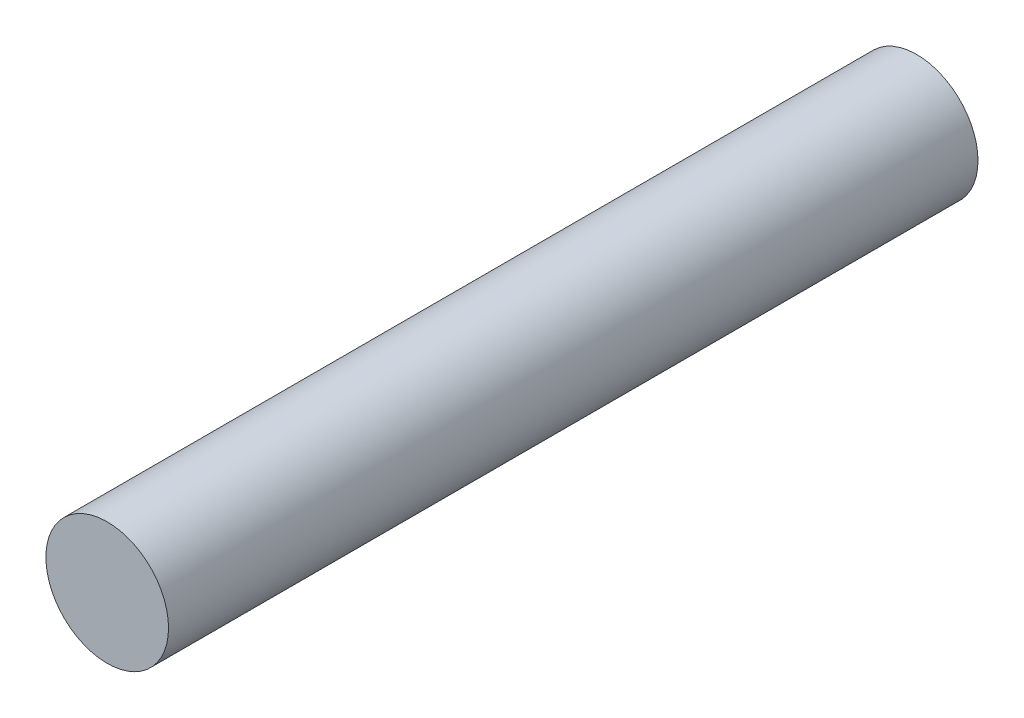
ISO-10303-21;
HEADER;
FILE_DESCRIPTION(('STEP AP214'),'2;1');
FILE_NAME('part.step','',(''),(''),'','','');
FILE_SCHEMA(('AUTOMOTIVE_DESIGN { 1 0 10303 214 1 1 1 1 }'));
ENDSEC;
DATA;
#1=APPLICATION_CONTEXT('core data for automotive mechanical design processes');
#2=APPLICATION_PROTOCOL_DEFINITION('international standard','automotive_design',2000,#1);
#3=PRODUCT_CONTEXT('',#1,'mechanical');
#4=PRODUCT('Part','Part','',(#3));
#5=PRODUCT_RELATED_PRODUCT_CATEGORY('part','',(#4));
#6=PRODUCT_DEFINITION_FORMATION('','',#4);
#7=PRODUCT_DEFINITION_CONTEXT('part definition',#1,'design');
#8=PRODUCT_DEFINITION('design','',#6,#7);
#9=PRODUCT_DEFINITION_SHAPE('','',#8);
#10=(LENGTH_UNIT() NAMED_UNIT(*) SI_UNIT(.MILLI.,.METRE.));
#11=(NAMED_UNIT(*) PLANE_ANGLE_UNIT() SI_UNIT($,.RADIAN.));
#12=(NAMED_UNIT(*) SI_UNIT($,.STERADIAN.) SOLID_ANGLE_UNIT());
#13=UNCERTAINTY_MEASURE_WITH_UNIT(LENGTH_MEASURE(1.E-05),#10,'distance_accuracy_value','');
#14=(GEOMETRIC_REPRESENTATION_CONTEXT(3) GLOBAL_UNCERTAINTY_ASSIGNED_CONTEXT((#13)) GLOBAL_UNIT_ASSIGNED_CONTEXT((#10,
#11,#12)) REPRESENTATION_CONTEXT('',''));
#15=CARTESIAN_POINT('',(0.,0.,0.));
#16=DIRECTION('',(0.,0.,1.));
#17=DIRECTION('',(1.,0.,0.));
#18=AXIS2_PLACEMENT_3D('',#15,#16,#17);
#19=CARTESIAN_POINT('',(0.,0.,33.));
#20=DIRECTION('',(0.,0.,-1.));
#21=DIRECTION('',(-1.,0.,0.));
#22=AXIS2_PLACEMENT_3D('',#19,#20,#21);
#23=CYLINDRICAL_SURFACE('',#22,2.5);
#24=CARTESIAN_POINT('',(0.,0.,33.));
#25=DIRECTION('',(0.,0.,1.));
#26=DIRECTION('',(1.,0.,0.));
#27=AXIS2_PLACEMENT_3D('',#24,#25,#26);
#28=CIRCLE('',#27,2.5);
#29=CARTESIAN_POINT('',(2.5,0.,33.));
#30=VERTEX_POINT('',#29);
#31=EDGE_CURVE('E10',#30,#30,#28,.T.);
#32=ORIENTED_EDGE('',*,*,#31,.F.);
#33=EDGE_LOOP('',(#32));
#34=FACE_BOUND('',#33,.T.);
#35=CARTESIAN_POINT('',(0.,0.,0.));
#36=DIRECTION('',(0.,0.,1.));
#37=DIRECTION('',(1.,0.,0.));
#38=AXIS2_PLACEMENT_3D('',#35,#36,#37);
#39=CIRCLE('',#38,2.5);
#40=CARTESIAN_POINT('',(2.5,0.,0.));
#41=VERTEX_POINT('',#40);
#42=EDGE_CURVE('E32',#41,#41,#39,.T.);
#43=ORIENTED_EDGE('',*,*,#42,.T.);
#44=EDGE_LOOP('',(#43));
#45=FACE_BOUND('',#44,.T.);
#46=ADVANCED_FACE('F29',(#34,#45),#23,.T.);
#47=CARTESIAN_POINT('',(0.,0.,33.));
#48=DIRECTION('',(0.,0.,1.));
#49=DIRECTION('',(1.,0.,0.));
#50=AXIS2_PLACEMENT_3D('',#47,#48,#49);
#51=PLANE('',#50);
#52=ORIENTED_EDGE('',*,*,#31,.T.);
#53=EDGE_LOOP('',(#52));
#54=FACE_BOUND('',#53,.T.);
#55=ADVANCED_FACE('F44',(#54),#51,.T.);
#56=CARTESIAN_POINT('',(0.,0.,0.));
#57=DIRECTION('',(0.,0.,1.));
#58=DIRECTION('',(1.,0.,0.));
#59=AXIS2_PLACEMENT_3D('',#56,#57,#58);
#60=PLANE('',#59);
#61=ORIENTED_EDGE('',*,*,#42,.F.);
#62=EDGE_LOOP('',(#61));
#63=FACE_BOUND('',#62,.T.);
#64=ADVANCED_FACE('F42',(#63),#60,.F.);
#65=CLOSED_SHELL('',(#46,#55,#64));
#66=MANIFOLD_SOLID_BREP('B2',#65);
#67=ADVANCED_BREP_SHAPE_REPRESENTATION('',(#18,#66),#14);
#68=SHAPE_DEFINITION_REPRESENTATION(#9,#67);
ENDSEC;
END-ISO-10303-21;
